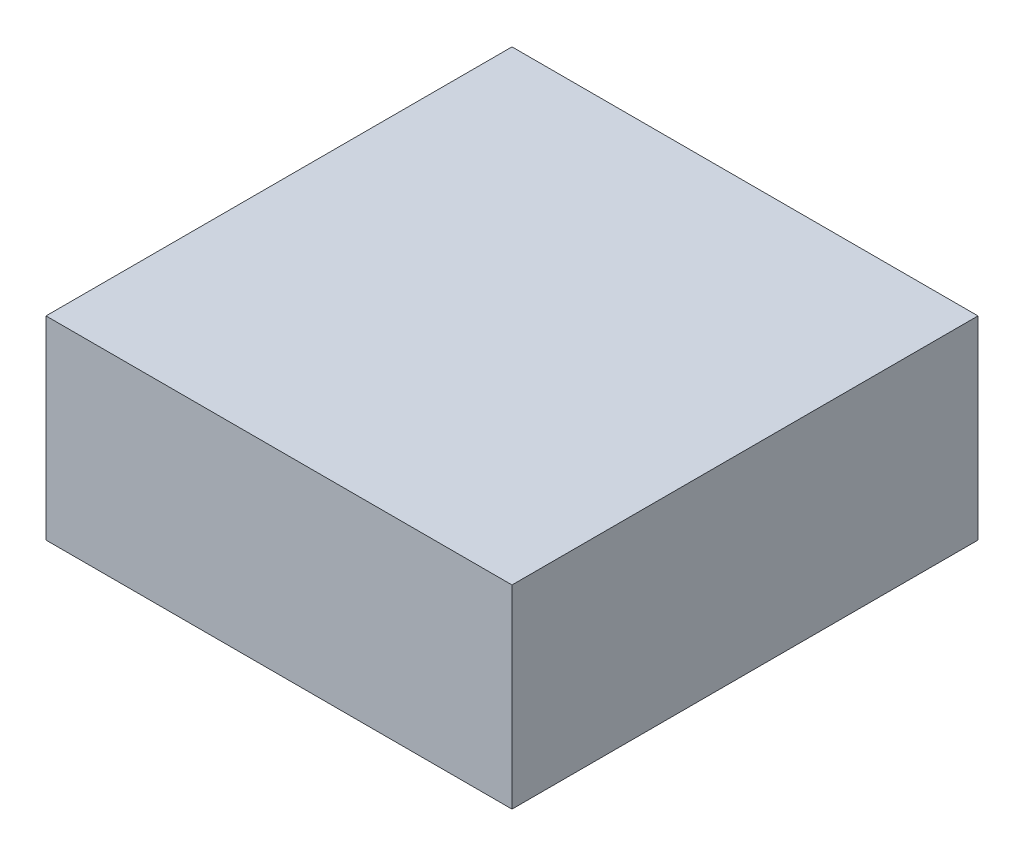
ISO-10303-21;
HEADER;
FILE_DESCRIPTION(('STEP AP214'),'2;1');
FILE_NAME('part.step','',(''),(''),'','','');
FILE_SCHEMA(('AUTOMOTIVE_DESIGN { 1 0 10303 214 1 1 1 1 }'));
ENDSEC;
DATA;
#1=APPLICATION_CONTEXT('core data for automotive mechanical design processes');
#2=APPLICATION_PROTOCOL_DEFINITION('international standard','automotive_design',2000,#1);
#3=PRODUCT_CONTEXT('',#1,'mechanical');
#4=PRODUCT('Part','Part','',(#3));
#5=PRODUCT_RELATED_PRODUCT_CATEGORY('part','',(#4));
#6=PRODUCT_DEFINITION_FORMATION('','',#4);
#7=PRODUCT_DEFINITION_CONTEXT('part definition',#1,'design');
#8=PRODUCT_DEFINITION('design','',#6,#7);
#9=PRODUCT_DEFINITION_SHAPE('','',#8);
#10=(LENGTH_UNIT() NAMED_UNIT(*) SI_UNIT(.MILLI.,.METRE.));
#11=(NAMED_UNIT(*) PLANE_ANGLE_UNIT() SI_UNIT($,.RADIAN.));
#12=(NAMED_UNIT(*) SI_UNIT($,.STERADIAN.) SOLID_ANGLE_UNIT());
#13=UNCERTAINTY_MEASURE_WITH_UNIT(LENGTH_MEASURE(1.E-05),#10,'distance_accuracy_value','');
#14=(GEOMETRIC_REPRESENTATION_CONTEXT(3) GLOBAL_UNCERTAINTY_ASSIGNED_CONTEXT((#13)) GLOBAL_UNIT_ASSIGNED_CONTEXT((#10,
#11,#12)) REPRESENTATION_CONTEXT('',''));
#15=CARTESIAN_POINT('',(0.,0.,0.));
#16=DIRECTION('',(0.,0.,1.));
#17=DIRECTION('',(1.,0.,0.));
#18=AXIS2_PLACEMENT_3D('',#15,#16,#17);
#19=CARTESIAN_POINT('',(19.05,15.875,19.05));
#20=DIRECTION('',(-1.,0.,0.));
#21=DIRECTION('',(0.,0.,1.));
#22=AXIS2_PLACEMENT_3D('',#19,#20,#21);
#23=PLANE('',#22);
#24=DIRECTION('',(0.,0.,-1.));
#25=VECTOR('',#24,1.);
#26=CARTESIAN_POINT('',(19.05,0.,19.05));
#27=LINE('',#26,#25);
#28=CARTESIAN_POINT('',(19.05,0.,19.05));
#29=VERTEX_POINT('',#28);
#30=CARTESIAN_POINT('',(19.05,0.,-19.05));
#31=VERTEX_POINT('',#30);
#32=EDGE_CURVE('E113',#29,#31,#27,.T.);
#33=ORIENTED_EDGE('',*,*,#32,.T.);
#34=DIRECTION('',(0.,-1.,0.));
#35=VECTOR('',#34,1.);
#36=CARTESIAN_POINT('',(19.05,15.875,-19.05));
#37=LINE('',#36,#35);
#38=CARTESIAN_POINT('',(19.05,15.875,-19.05));
#39=VERTEX_POINT('',#38);
#40=EDGE_CURVE('E11',#39,#31,#37,.T.);
#41=ORIENTED_EDGE('',*,*,#40,.F.);
#42=DIRECTION('',(0.,0.,-1.));
#43=VECTOR('',#42,1.);
#44=CARTESIAN_POINT('',(19.05,15.875,19.05));
#45=LINE('',#44,#43);
#46=CARTESIAN_POINT('',(19.05,15.875,19.05));
#47=VERTEX_POINT('',#46);
#48=EDGE_CURVE('E97',#47,#39,#45,.T.);
#49=ORIENTED_EDGE('',*,*,#48,.F.);
#50=DIRECTION('',(0.,-1.,0.));
#51=VECTOR('',#50,1.);
#52=CARTESIAN_POINT('',(19.05,15.875,19.05));
#53=LINE('',#52,#51);
#54=EDGE_CURVE('E109',#47,#29,#53,.T.);
#55=ORIENTED_EDGE('',*,*,#54,.T.);
#56=EDGE_LOOP('',(#33,#41,#49,#55));
#57=FACE_BOUND('',#56,.T.);
#58=ADVANCED_FACE('F45',(#57),#23,.F.);
#59=CARTESIAN_POINT('',(-19.05,15.875,-19.05));
#60=DIRECTION('',(0.,0.,1.));
#61=DIRECTION('',(1.,0.,0.));
#62=AXIS2_PLACEMENT_3D('',#59,#60,#61);
#63=PLANE('',#62);
#64=DIRECTION('',(-1.,0.,0.));
#65=VECTOR('',#64,1.);
#66=CARTESIAN_POINT('',(-19.05,0.,-19.05));
#67=LINE('',#66,#65);
#68=CARTESIAN_POINT('',(-19.05,0.,-19.05));
#69=VERTEX_POINT('',#68);
#70=EDGE_CURVE('E102',#31,#69,#67,.T.);
#71=ORIENTED_EDGE('',*,*,#70,.T.);
#72=DIRECTION('',(0.,-1.,0.));
#73=VECTOR('',#72,1.);
#74=CARTESIAN_POINT('',(-19.05,15.875,-19.05));
#75=LINE('',#74,#73);
#76=CARTESIAN_POINT('',(-19.05,15.875,-19.05));
#77=VERTEX_POINT('',#76);
#78=EDGE_CURVE('E54',#77,#69,#75,.T.);
#79=ORIENTED_EDGE('',*,*,#78,.F.);
#80=DIRECTION('',(-1.,0.,0.));
#81=VECTOR('',#80,1.);
#82=CARTESIAN_POINT('',(-19.05,15.875,-19.05));
#83=LINE('',#82,#81);
#84=EDGE_CURVE('E92',#39,#77,#83,.T.);
#85=ORIENTED_EDGE('',*,*,#84,.F.);
#86=ORIENTED_EDGE('',*,*,#40,.T.);
#87=EDGE_LOOP('',(#71,#79,#85,#86));
#88=FACE_BOUND('',#87,.T.);
#89=ADVANCED_FACE('F101',(#88),#63,.F.);
#90=CARTESIAN_POINT('',(-19.05,15.875,19.05));
#91=DIRECTION('',(1.,0.,0.));
#92=DIRECTION('',(0.,0.,-1.));
#93=AXIS2_PLACEMENT_3D('',#90,#91,#92);
#94=PLANE('',#93);
#95=DIRECTION('',(0.,0.,1.));
#96=VECTOR('',#95,1.);
#97=CARTESIAN_POINT('',(-19.05,0.,19.05));
#98=LINE('',#97,#96);
#99=CARTESIAN_POINT('',(-19.05,0.,19.05));
#100=VERTEX_POINT('',#99);
#101=EDGE_CURVE('E79',#69,#100,#98,.T.);
#102=ORIENTED_EDGE('',*,*,#101,.T.);
#103=DIRECTION('',(0.,-1.,0.));
#104=VECTOR('',#103,1.);
#105=CARTESIAN_POINT('',(-19.05,15.875,19.05));
#106=LINE('',#105,#104);
#107=CARTESIAN_POINT('',(-19.05,15.875,19.05));
#108=VERTEX_POINT('',#107);
#109=EDGE_CURVE('E104',#108,#100,#106,.T.);
#110=ORIENTED_EDGE('',*,*,#109,.F.);
#111=DIRECTION('',(0.,0.,1.));
#112=VECTOR('',#111,1.);
#113=CARTESIAN_POINT('',(-19.05,15.875,19.05));
#114=LINE('',#113,#112);
#115=EDGE_CURVE('E95',#77,#108,#114,.T.);
#116=ORIENTED_EDGE('',*,*,#115,.F.);
#117=ORIENTED_EDGE('',*,*,#78,.T.);
#118=EDGE_LOOP('',(#102,#110,#116,#117));
#119=FACE_BOUND('',#118,.T.);
#120=ADVANCED_FACE('F105',(#119),#94,.F.);
#121=CARTESIAN_POINT('',(-19.05,15.875,19.05));
#122=DIRECTION('',(0.,0.,-1.));
#123=DIRECTION('',(-1.,0.,0.));
#124=AXIS2_PLACEMENT_3D('',#121,#122,#123);
#125=PLANE('',#124);
#126=DIRECTION('',(1.,0.,0.));
#127=VECTOR('',#126,1.);
#128=CARTESIAN_POINT('',(-19.05,0.,19.05));
#129=LINE('',#128,#127);
#130=EDGE_CURVE('E85',#100,#29,#129,.T.);
#131=ORIENTED_EDGE('',*,*,#130,.T.);
#132=ORIENTED_EDGE('',*,*,#54,.F.);
#133=DIRECTION('',(1.,0.,0.));
#134=VECTOR('',#133,1.);
#135=CARTESIAN_POINT('',(-19.05,15.875,19.05));
#136=LINE('',#135,#134);
#137=EDGE_CURVE('E62',#108,#47,#136,.T.);
#138=ORIENTED_EDGE('',*,*,#137,.F.);
#139=ORIENTED_EDGE('',*,*,#109,.T.);
#140=EDGE_LOOP('',(#131,#132,#138,#139));
#141=FACE_BOUND('',#140,.T.);
#142=ADVANCED_FACE('F126',(#141),#125,.F.);
#143=CARTESIAN_POINT('',(0.,15.875,0.));
#144=DIRECTION('',(0.,-1.,0.));
#145=DIRECTION('',(0.,0.,-1.));
#146=AXIS2_PLACEMENT_3D('',#143,#144,#145);
#147=PLANE('',#146);
#148=ORIENTED_EDGE('',*,*,#48,.T.);
#149=ORIENTED_EDGE('',*,*,#84,.T.);
#150=ORIENTED_EDGE('',*,*,#115,.T.);
#151=ORIENTED_EDGE('',*,*,#137,.T.);
#152=EDGE_LOOP('',(#148,#149,#150,#151));
#153=FACE_BOUND('',#152,.T.);
#154=ADVANCED_FACE('F93',(#153),#147,.F.);
#155=CARTESIAN_POINT('',(0.,0.,0.));
#156=DIRECTION('',(0.,-1.,0.));
#157=DIRECTION('',(0.,0.,-1.));
#158=AXIS2_PLACEMENT_3D('',#155,#156,#157);
#159=PLANE('',#158);
#160=ORIENTED_EDGE('',*,*,#32,.F.);
#161=ORIENTED_EDGE('',*,*,#130,.F.);
#162=ORIENTED_EDGE('',*,*,#101,.F.);
#163=ORIENTED_EDGE('',*,*,#70,.F.);
#164=EDGE_LOOP('',(#160,#161,#162,#163));
#165=FACE_BOUND('',#164,.T.);
#166=ADVANCED_FACE('F129',(#165),#159,.T.);
#167=CLOSED_SHELL('',(#58,#89,#120,#142,#154,#166));
#168=MANIFOLD_SOLID_BREP('B2',#167);
#169=ADVANCED_BREP_SHAPE_REPRESENTATION('',(#18,#168),#14);
#170=SHAPE_DEFINITION_REPRESENTATION(#9,#169);
ENDSEC;
END-ISO-10303-21;
